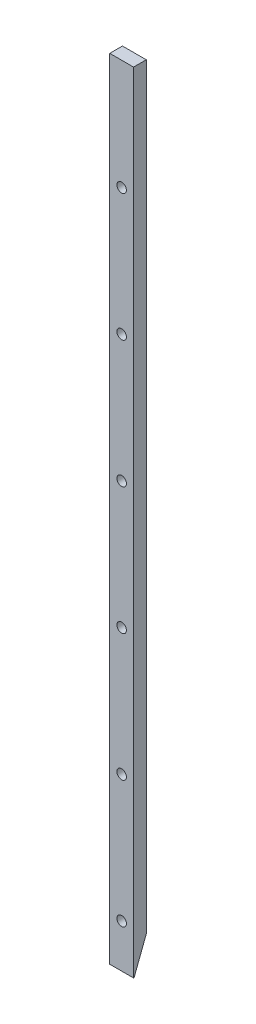
ISO-10303-21;
HEADER;
FILE_DESCRIPTION(('STEP AP214'),'2;1');
FILE_NAME('part.step','',(''),(''),'','','');
FILE_SCHEMA(('AUTOMOTIVE_DESIGN { 1 0 10303 214 1 1 1 1 }'));
ENDSEC;
DATA;
#1=APPLICATION_CONTEXT('core data for automotive mechanical design processes');
#2=APPLICATION_PROTOCOL_DEFINITION('international standard','automotive_design',2000,#1);
#3=PRODUCT_CONTEXT('',#1,'mechanical');
#4=PRODUCT('Part','Part','',(#3));
#5=PRODUCT_RELATED_PRODUCT_CATEGORY('part','',(#4));
#6=PRODUCT_DEFINITION_FORMATION('','',#4);
#7=PRODUCT_DEFINITION_CONTEXT('part definition',#1,'design');
#8=PRODUCT_DEFINITION('design','',#6,#7);
#9=PRODUCT_DEFINITION_SHAPE('','',#8);
#10=(LENGTH_UNIT() NAMED_UNIT(*) SI_UNIT(.MILLI.,.METRE.));
#11=(NAMED_UNIT(*) PLANE_ANGLE_UNIT() SI_UNIT($,.RADIAN.));
#12=(NAMED_UNIT(*) SI_UNIT($,.STERADIAN.) SOLID_ANGLE_UNIT());
#13=UNCERTAINTY_MEASURE_WITH_UNIT(LENGTH_MEASURE(1.E-05),#10,'distance_accuracy_value','');
#14=(GEOMETRIC_REPRESENTATION_CONTEXT(3) GLOBAL_UNCERTAINTY_ASSIGNED_CONTEXT((#13)) GLOBAL_UNIT_ASSIGNED_CONTEXT((#10,
#11,#12)) REPRESENTATION_CONTEXT('',''));
#15=CARTESIAN_POINT('',(0.,0.,0.));
#16=DIRECTION('',(0.,0.,1.));
#17=DIRECTION('',(1.,0.,0.));
#18=AXIS2_PLACEMENT_3D('',#15,#16,#17);
#19=CARTESIAN_POINT('',(0.,-221.04774439,-4.00000000000006));
#20=DIRECTION('',(0.,0.,1.));
#21=DIRECTION('',(1.,0.,0.));
#22=AXIS2_PLACEMENT_3D('',#19,#20,#21);
#23=CYLINDRICAL_SURFACE('',#22,3.);
#24=CARTESIAN_POINT('',(0.,-221.04774439,-1.00000000000017));
#25=DIRECTION('',(0.,0.,-1.));
#26=DIRECTION('',(-1.,0.,0.));
#27=AXIS2_PLACEMENT_3D('',#24,#25,#26);
#28=CIRCLE('',#27,3.);
#29=CARTESIAN_POINT('',(-3.00000000000003,-221.04774439,-1.00000000000017));
#30=VERTEX_POINT('',#29);
#31=EDGE_CURVE('E11',#30,#30,#28,.T.);
#32=ORIENTED_EDGE('',*,*,#31,.T.);
#33=EDGE_LOOP('',(#32));
#34=FACE_BOUND('',#33,.T.);
#35=CARTESIAN_POINT('',(0.,-221.04774439,3.99999999999995));
#36=DIRECTION('',(0.,0.,1.));
#37=DIRECTION('',(1.,0.,0.));
#38=AXIS2_PLACEMENT_3D('',#35,#36,#37);
#39=CIRCLE('',#38,3.);
#40=CARTESIAN_POINT('',(2.99999999999994,-221.04774439,3.99999999999995));
#41=VERTEX_POINT('',#40);
#42=EDGE_CURVE('E148',#41,#41,#39,.T.);
#43=ORIENTED_EDGE('',*,*,#42,.T.);
#44=EDGE_LOOP('',(#43));
#45=FACE_BOUND('',#44,.T.);
#46=ADVANCED_FACE('F42',(#34,#45),#23,.F.);
#47=CARTESIAN_POINT('',(0.,-141.04774439,-4.00000000000011));
#48=DIRECTION('',(0.,0.,1.));
#49=DIRECTION('',(1.,0.,0.));
#50=AXIS2_PLACEMENT_3D('',#47,#48,#49);
#51=CYLINDRICAL_SURFACE('',#50,3.);
#52=CARTESIAN_POINT('',(0.,-141.04774439,-1.00000000000011));
#53=DIRECTION('',(0.,0.,-1.));
#54=DIRECTION('',(-1.,0.,0.));
#55=AXIS2_PLACEMENT_3D('',#52,#53,#54);
#56=CIRCLE('',#55,3.);
#57=CARTESIAN_POINT('',(-3.00000000000003,-141.04774439,-1.00000000000011));
#58=VERTEX_POINT('',#57);
#59=EDGE_CURVE('E52',#58,#58,#56,.T.);
#60=ORIENTED_EDGE('',*,*,#59,.T.);
#61=EDGE_LOOP('',(#60));
#62=FACE_BOUND('',#61,.T.);
#63=CARTESIAN_POINT('',(-1.38777878078145E-13,-141.04774439,4.00000000000006));
#64=DIRECTION('',(0.,0.,1.));
#65=DIRECTION('',(1.,0.,0.));
#66=AXIS2_PLACEMENT_3D('',#63,#64,#65);
#67=CIRCLE('',#66,3.);
#68=CARTESIAN_POINT('',(2.99999999999986,-141.04774439,4.00000000000006));
#69=VERTEX_POINT('',#68);
#70=EDGE_CURVE('E144',#69,#69,#67,.T.);
#71=ORIENTED_EDGE('',*,*,#70,.T.);
#72=EDGE_LOOP('',(#71));
#73=FACE_BOUND('',#72,.T.);
#74=ADVANCED_FACE('F196',(#62,#73),#51,.F.);
#75=CARTESIAN_POINT('',(0.,-61.04774439,-4.00000000000011));
#76=DIRECTION('',(0.,0.,1.));
#77=DIRECTION('',(1.,0.,0.));
#78=AXIS2_PLACEMENT_3D('',#75,#76,#77);
#79=CYLINDRICAL_SURFACE('',#78,3.);
#80=CARTESIAN_POINT('',(-1.11022302462516E-13,-61.0477443899999,-1.00000000000017));
#81=DIRECTION('',(0.,0.,-1.));
#82=DIRECTION('',(-1.,0.,0.));
#83=AXIS2_PLACEMENT_3D('',#80,#81,#82);
#84=CIRCLE('',#83,3.);
#85=CARTESIAN_POINT('',(-3.00000000000011,-61.0477443899999,-1.00000000000017));
#86=VERTEX_POINT('',#85);
#87=EDGE_CURVE('E188',#86,#86,#84,.T.);
#88=ORIENTED_EDGE('',*,*,#87,.T.);
#89=EDGE_LOOP('',(#88));
#90=FACE_BOUND('',#89,.T.);
#91=CARTESIAN_POINT('',(-1.11022302462516E-13,-61.0477443899999,3.99999999999984));
#92=DIRECTION('',(0.,0.,1.));
#93=DIRECTION('',(1.,0.,0.));
#94=AXIS2_PLACEMENT_3D('',#91,#92,#93);
#95=CIRCLE('',#94,3.);
#96=CARTESIAN_POINT('',(2.99999999999989,-61.0477443899999,3.99999999999984));
#97=VERTEX_POINT('',#96);
#98=EDGE_CURVE('E140',#97,#97,#95,.T.);
#99=ORIENTED_EDGE('',*,*,#98,.T.);
#100=EDGE_LOOP('',(#99));
#101=FACE_BOUND('',#100,.T.);
#102=ADVANCED_FACE('F270',(#90,#101),#79,.F.);
#103=CARTESIAN_POINT('',(0.,18.9522556099998,-4.00000000000006));
#104=DIRECTION('',(0.,0.,1.));
#105=DIRECTION('',(1.,0.,0.));
#106=AXIS2_PLACEMENT_3D('',#103,#104,#105);
#107=CYLINDRICAL_SURFACE('',#106,3.);
#108=CARTESIAN_POINT('',(0.,18.9522556099999,-1.00000000000011));
#109=DIRECTION('',(0.,0.,-1.));
#110=DIRECTION('',(-1.,0.,0.));
#111=AXIS2_PLACEMENT_3D('',#108,#109,#110);
#112=CIRCLE('',#111,3.);
#113=CARTESIAN_POINT('',(-3.00000000000006,18.9522556099999,-1.00000000000011));
#114=VERTEX_POINT('',#113);
#115=EDGE_CURVE('E184',#114,#114,#112,.T.);
#116=ORIENTED_EDGE('',*,*,#115,.T.);
#117=EDGE_LOOP('',(#116));
#118=FACE_BOUND('',#117,.T.);
#119=CARTESIAN_POINT('',(0.,18.9522556099999,3.99999999999989));
#120=DIRECTION('',(0.,0.,1.));
#121=DIRECTION('',(1.,0.,0.));
#122=AXIS2_PLACEMENT_3D('',#119,#120,#121);
#123=CIRCLE('',#122,3.);
#124=CARTESIAN_POINT('',(2.99999999999997,18.9522556099999,3.99999999999989));
#125=VERTEX_POINT('',#124);
#126=EDGE_CURVE('E136',#125,#125,#123,.T.);
#127=ORIENTED_EDGE('',*,*,#126,.T.);
#128=EDGE_LOOP('',(#127));
#129=FACE_BOUND('',#128,.T.);
#130=ADVANCED_FACE('F316',(#118,#129),#107,.F.);
#131=CARTESIAN_POINT('',(7.49999999999998,-248.41,4.));
#132=DIRECTION('',(-1.,0.,0.));
#133=DIRECTION('',(0.,0.,1.));
#134=AXIS2_PLACEMENT_3D('',#131,#132,#133);
#135=PLANE('',#134);
#136=DIRECTION('',(0.,0.,-1.));
#137=VECTOR('',#136,1.);
#138=CARTESIAN_POINT('',(7.49999999999998,-248.41,4.));
#139=LINE('',#138,#137);
#140=CARTESIAN_POINT('',(7.49999999999998,-248.41,4.));
#141=VERTEX_POINT('',#140);
#142=CARTESIAN_POINT('',(7.50000000000001,-248.41,3.67728070070827));
#143=VERTEX_POINT('',#142);
#144=EDGE_CURVE('E227',#141,#143,#139,.T.);
#145=ORIENTED_EDGE('',*,*,#144,.T.);
#146=DIRECTION('',(0.,0.933580426497203,-0.358367949545297));
#147=VECTOR('',#146,1.);
#148=CARTESIAN_POINT('',(7.50000000000001,-248.41,3.67728070070827));
#149=LINE('',#148,#147);
#150=CARTESIAN_POINT('',(7.4999999999999,-228.41,-4.00000000000006));
#151=VERTEX_POINT('',#150);
#152=EDGE_CURVE('E67',#143,#151,#149,.T.);
#153=ORIENTED_EDGE('',*,*,#152,.T.);
#154=DIRECTION('',(0.,1.,0.));
#155=VECTOR('',#154,1.);
#156=CARTESIAN_POINT('',(7.49999999999995,-248.41,-4.00000000000011));
#157=LINE('',#156,#155);
#158=CARTESIAN_POINT('',(7.50000000000002,248.41,-4.00000000000011));
#159=VERTEX_POINT('',#158);
#160=EDGE_CURVE('E115',#151,#159,#157,.T.);
#161=ORIENTED_EDGE('',*,*,#160,.T.);
#162=DIRECTION('',(0.,0.,-1.));
#163=VECTOR('',#162,1.);
#164=CARTESIAN_POINT('',(7.49999999999997,248.41,4.));
#165=LINE('',#164,#163);
#166=CARTESIAN_POINT('',(7.49999999999997,248.41,4.));
#167=VERTEX_POINT('',#166);
#168=EDGE_CURVE('E96',#167,#159,#165,.T.);
#169=ORIENTED_EDGE('',*,*,#168,.F.);
#170=DIRECTION('',(0.,1.,0.));
#171=VECTOR('',#170,1.);
#172=CARTESIAN_POINT('',(7.49999999999998,-248.41,4.));
#173=LINE('',#172,#171);
#174=EDGE_CURVE('E103',#141,#167,#173,.T.);
#175=ORIENTED_EDGE('',*,*,#174,.F.);
#176=EDGE_LOOP('',(#145,#153,#161,#169,#175));
#177=FACE_BOUND('',#176,.T.);
#178=ADVANCED_FACE('F114',(#177),#135,.F.);
#179=CARTESIAN_POINT('',(-7.50000000000003,248.41,3.99999999999995));
#180=DIRECTION('',(0.,-1.,0.));
#181=DIRECTION('',(0.,0.,-1.));
#182=AXIS2_PLACEMENT_3D('',#179,#180,#181);
#183=PLANE('',#182);
#184=DIRECTION('',(-1.,0.,0.));
#185=VECTOR('',#184,1.);
#186=CARTESIAN_POINT('',(-7.50000000000003,248.41,-4.));
#187=LINE('',#186,#185);
#188=CARTESIAN_POINT('',(-7.50000000000003,248.41,-4.));
#189=VERTEX_POINT('',#188);
#190=EDGE_CURVE('E212',#159,#189,#187,.T.);
#191=ORIENTED_EDGE('',*,*,#190,.T.);
#192=DIRECTION('',(0.,0.,-1.));
#193=VECTOR('',#192,1.);
#194=CARTESIAN_POINT('',(-7.50000000000003,248.41,3.99999999999995));
#195=LINE('',#194,#193);
#196=CARTESIAN_POINT('',(-7.50000000000003,248.41,3.99999999999995));
#197=VERTEX_POINT('',#196);
#198=EDGE_CURVE('E98',#197,#189,#195,.T.);
#199=ORIENTED_EDGE('',*,*,#198,.F.);
#200=DIRECTION('',(-1.,0.,0.));
#201=VECTOR('',#200,1.);
#202=CARTESIAN_POINT('',(-7.50000000000003,248.41,3.99999999999995));
#203=LINE('',#202,#201);
#204=EDGE_CURVE('E92',#167,#197,#203,.T.);
#205=ORIENTED_EDGE('',*,*,#204,.F.);
#206=ORIENTED_EDGE('',*,*,#168,.T.);
#207=EDGE_LOOP('',(#191,#199,#205,#206));
#208=FACE_BOUND('',#207,.T.);
#209=ADVANCED_FACE('F94',(#208),#183,.F.);
#210=CARTESIAN_POINT('',(-7.50000000000015,-248.41,3.99999999999989));
#211=DIRECTION('',(1.,0.,0.));
#212=DIRECTION('',(0.,0.,-1.));
#213=AXIS2_PLACEMENT_3D('',#210,#211,#212);
#214=PLANE('',#213);
#215=DIRECTION('',(0.,-1.,0.));
#216=VECTOR('',#215,1.);
#217=CARTESIAN_POINT('',(-7.50000000000009,-248.41,-3.99999999999995));
#218=LINE('',#217,#216);
#219=CARTESIAN_POINT('',(-7.50000000000012,-228.41,-4.00000000000011));
#220=VERTEX_POINT('',#219);
#221=EDGE_CURVE('E112',#189,#220,#218,.T.);
#222=ORIENTED_EDGE('',*,*,#221,.T.);
#223=DIRECTION('',(0.,-0.933580426497203,0.358367949545297));
#224=VECTOR('',#223,1.);
#225=CARTESIAN_POINT('',(-7.50000000000003,-248.41,3.67728070070833));
#226=LINE('',#225,#224);
#227=CARTESIAN_POINT('',(-7.50000000000003,-248.41,3.67728070070833));
#228=VERTEX_POINT('',#227);
#229=EDGE_CURVE('E133',#220,#228,#226,.T.);
#230=ORIENTED_EDGE('',*,*,#229,.T.);
#231=DIRECTION('',(0.,0.,-1.));
#232=VECTOR('',#231,1.);
#233=CARTESIAN_POINT('',(-7.50000000000015,-248.41,3.99999999999989));
#234=LINE('',#233,#232);
#235=CARTESIAN_POINT('',(-7.50000000000015,-248.41,3.99999999999989));
#236=VERTEX_POINT('',#235);
#237=EDGE_CURVE('E125',#236,#228,#234,.T.);
#238=ORIENTED_EDGE('',*,*,#237,.F.);
#239=DIRECTION('',(0.,-1.,0.));
#240=VECTOR('',#239,1.);
#241=CARTESIAN_POINT('',(-7.50000000000015,-248.41,3.99999999999989));
#242=LINE('',#241,#240);
#243=EDGE_CURVE('E102',#197,#236,#242,.T.);
#244=ORIENTED_EDGE('',*,*,#243,.F.);
#245=ORIENTED_EDGE('',*,*,#198,.T.);
#246=EDGE_LOOP('',(#222,#230,#238,#244,#245));
#247=FACE_BOUND('',#246,.T.);
#248=ADVANCED_FACE('F223',(#247),#214,.F.);
#249=CARTESIAN_POINT('',(-7.50000000000015,-248.41,3.99999999999989));
#250=DIRECTION('',(0.,1.,0.));
#251=DIRECTION('',(0.,0.,1.));
#252=AXIS2_PLACEMENT_3D('',#249,#250,#251);
#253=PLANE('',#252);
#254=ORIENTED_EDGE('',*,*,#237,.T.);
#255=DIRECTION('',(1.,0.,0.));
#256=VECTOR('',#255,1.);
#257=CARTESIAN_POINT('',(7.50000000000001,-248.41,3.67728070070827));
#258=LINE('',#257,#256);
#259=EDGE_CURVE('E118',#228,#143,#258,.T.);
#260=ORIENTED_EDGE('',*,*,#259,.T.);
#261=ORIENTED_EDGE('',*,*,#144,.F.);
#262=DIRECTION('',(1.,0.,0.));
#263=VECTOR('',#262,1.);
#264=CARTESIAN_POINT('',(-7.50000000000015,-248.41,3.99999999999989));
#265=LINE('',#264,#263);
#266=EDGE_CURVE('E109',#236,#141,#265,.T.);
#267=ORIENTED_EDGE('',*,*,#266,.F.);
#268=EDGE_LOOP('',(#254,#260,#261,#267));
#269=FACE_BOUND('',#268,.T.);
#270=ADVANCED_FACE('F225',(#269),#253,.F.);
#271=CARTESIAN_POINT('',(0.,2.22044604925031E-13,3.99999999999995));
#272=DIRECTION('',(0.,0.,-1.));
#273=DIRECTION('',(-1.,0.,0.));
#274=AXIS2_PLACEMENT_3D('',#271,#272,#273);
#275=PLANE('',#274);
#276=CARTESIAN_POINT('',(0.,98.95225561,3.99999999999989));
#277=DIRECTION('',(0.,0.,1.));
#278=DIRECTION('',(1.,0.,0.));
#279=AXIS2_PLACEMENT_3D('',#276,#277,#278);
#280=CIRCLE('',#279,3.);
#281=CARTESIAN_POINT('',(2.99999999999993,98.95225561,3.99999999999989));
#282=VERTEX_POINT('',#281);
#283=EDGE_CURVE('E243',#282,#282,#280,.T.);
#284=ORIENTED_EDGE('',*,*,#283,.F.);
#285=EDGE_LOOP('',(#284));
#286=FACE_BOUND('',#285,.T.);
#287=CARTESIAN_POINT('',(0.,178.95225561,4.));
#288=DIRECTION('',(0.,0.,1.));
#289=DIRECTION('',(1.,0.,0.));
#290=AXIS2_PLACEMENT_3D('',#287,#288,#289);
#291=CIRCLE('',#290,3.);
#292=CARTESIAN_POINT('',(2.99999999999994,178.95225561,4.));
#293=VERTEX_POINT('',#292);
#294=EDGE_CURVE('E214',#293,#293,#291,.T.);
#295=ORIENTED_EDGE('',*,*,#294,.F.);
#296=EDGE_LOOP('',(#295));
#297=FACE_BOUND('',#296,.T.);
#298=ORIENTED_EDGE('',*,*,#174,.T.);
#299=ORIENTED_EDGE('',*,*,#204,.T.);
#300=ORIENTED_EDGE('',*,*,#243,.T.);
#301=ORIENTED_EDGE('',*,*,#266,.T.);
#302=EDGE_LOOP('',(#298,#299,#300,#301));
#303=FACE_BOUND('',#302,.T.);
#304=ORIENTED_EDGE('',*,*,#126,.F.);
#305=EDGE_LOOP('',(#304));
#306=FACE_BOUND('',#305,.T.);
#307=ORIENTED_EDGE('',*,*,#98,.F.);
#308=EDGE_LOOP('',(#307));
#309=FACE_BOUND('',#308,.T.);
#310=ORIENTED_EDGE('',*,*,#70,.F.);
#311=EDGE_LOOP('',(#310));
#312=FACE_BOUND('',#311,.T.);
#313=ORIENTED_EDGE('',*,*,#42,.F.);
#314=EDGE_LOOP('',(#313));
#315=FACE_BOUND('',#314,.T.);
#316=ADVANCED_FACE('F106',(#286,#297,#303,#306,#309,#312,#315),#275,.F.);
#317=CARTESIAN_POINT('',(0.,1.11022302462516E-13,-4.00000000000011));
#318=DIRECTION('',(0.,0.,-1.));
#319=DIRECTION('',(-1.,0.,0.));
#320=AXIS2_PLACEMENT_3D('',#317,#318,#319);
#321=PLANE('',#320);
#322=CARTESIAN_POINT('',(0.,178.95225561,-4.00000000000006));
#323=DIRECTION('',(0.,0.,-1.));
#324=DIRECTION('',(-1.,0.,0.));
#325=AXIS2_PLACEMENT_3D('',#322,#323,#324);
#326=CIRCLE('',#325,6.00000000000001);
#327=CARTESIAN_POINT('',(-6.00000000000003,178.95225561,-4.00000000000006));
#328=VERTEX_POINT('',#327);
#329=EDGE_CURVE('E172',#328,#328,#326,.F.);
#330=ORIENTED_EDGE('',*,*,#329,.T.);
#331=EDGE_LOOP('',(#330));
#332=FACE_BOUND('',#331,.T.);
#333=CARTESIAN_POINT('',(0.,98.9522556100002,-4.00000000000006));
#334=DIRECTION('',(0.,0.,-1.));
#335=DIRECTION('',(-1.,0.,0.));
#336=AXIS2_PLACEMENT_3D('',#333,#334,#335);
#337=CIRCLE('',#336,6.00000000000001);
#338=CARTESIAN_POINT('',(-6.00000000000003,98.9522556100002,-4.00000000000006));
#339=VERTEX_POINT('',#338);
#340=EDGE_CURVE('E168',#339,#339,#337,.F.);
#341=ORIENTED_EDGE('',*,*,#340,.T.);
#342=EDGE_LOOP('',(#341));
#343=FACE_BOUND('',#342,.T.);
#344=CARTESIAN_POINT('',(0.,18.9522556099998,-4.00000000000006));
#345=DIRECTION('',(0.,0.,-1.));
#346=DIRECTION('',(-1.,0.,0.));
#347=AXIS2_PLACEMENT_3D('',#344,#345,#346);
#348=CIRCLE('',#347,6.00000000000001);
#349=CARTESIAN_POINT('',(-6.00000000000003,18.9522556099998,-4.00000000000006));
#350=VERTEX_POINT('',#349);
#351=EDGE_CURVE('E164',#350,#350,#348,.F.);
#352=ORIENTED_EDGE('',*,*,#351,.T.);
#353=EDGE_LOOP('',(#352));
#354=FACE_BOUND('',#353,.T.);
#355=CARTESIAN_POINT('',(0.,-61.04774439,-4.00000000000011));
#356=DIRECTION('',(0.,0.,-1.));
#357=DIRECTION('',(-1.,0.,0.));
#358=AXIS2_PLACEMENT_3D('',#355,#356,#357);
#359=CIRCLE('',#358,6.00000000000001);
#360=CARTESIAN_POINT('',(-6.00000000000006,-61.04774439,-4.00000000000012));
#361=VERTEX_POINT('',#360);
#362=EDGE_CURVE('E160',#361,#361,#359,.F.);
#363=ORIENTED_EDGE('',*,*,#362,.T.);
#364=EDGE_LOOP('',(#363));
#365=FACE_BOUND('',#364,.T.);
#366=CARTESIAN_POINT('',(0.,-141.04774439,-4.00000000000011));
#367=DIRECTION('',(0.,0.,-1.));
#368=DIRECTION('',(-1.,0.,0.));
#369=AXIS2_PLACEMENT_3D('',#366,#367,#368);
#370=CIRCLE('',#369,6.00000000000001);
#371=CARTESIAN_POINT('',(-6.00000000000009,-141.04774439,-4.00000000000012));
#372=VERTEX_POINT('',#371);
#373=EDGE_CURVE('E156',#372,#372,#370,.F.);
#374=ORIENTED_EDGE('',*,*,#373,.T.);
#375=EDGE_LOOP('',(#374));
#376=FACE_BOUND('',#375,.T.);
#377=CARTESIAN_POINT('',(0.,-221.04774439,-4.00000000000006));
#378=DIRECTION('',(0.,0.,-1.));
#379=DIRECTION('',(-1.,0.,0.));
#380=AXIS2_PLACEMENT_3D('',#377,#378,#379);
#381=CIRCLE('',#380,6.00000000000001);
#382=CARTESIAN_POINT('',(-6.00000000000003,-221.04774439,-4.00000000000006));
#383=VERTEX_POINT('',#382);
#384=EDGE_CURVE('E152',#383,#383,#381,.F.);
#385=ORIENTED_EDGE('',*,*,#384,.T.);
#386=EDGE_LOOP('',(#385));
#387=FACE_BOUND('',#386,.T.);
#388=ORIENTED_EDGE('',*,*,#160,.F.);
#389=DIRECTION('',(-1.,0.,0.));
#390=VECTOR('',#389,1.);
#391=CARTESIAN_POINT('',(-7.50000000000012,-228.41,-4.00000000000011));
#392=LINE('',#391,#390);
#393=EDGE_CURVE('E59',#151,#220,#392,.T.);
#394=ORIENTED_EDGE('',*,*,#393,.T.);
#395=ORIENTED_EDGE('',*,*,#221,.F.);
#396=ORIENTED_EDGE('',*,*,#190,.F.);
#397=EDGE_LOOP('',(#388,#394,#395,#396));
#398=FACE_BOUND('',#397,.T.);
#399=ADVANCED_FACE('F205',(#332,#343,#354,#365,#376,#387,#398),#321,.T.);
#400=CARTESIAN_POINT('',(0.,178.95225561,-4.00000000000006));
#401=DIRECTION('',(0.,0.,1.));
#402=DIRECTION('',(1.,0.,0.));
#403=AXIS2_PLACEMENT_3D('',#400,#401,#402);
#404=CYLINDRICAL_SURFACE('',#403,3.);
#405=CARTESIAN_POINT('',(0.,178.95225561,-1.00000000000017));
#406=DIRECTION('',(0.,0.,-1.));
#407=DIRECTION('',(-1.,0.,0.));
#408=AXIS2_PLACEMENT_3D('',#405,#406,#407);
#409=CIRCLE('',#408,3.);
#410=CARTESIAN_POINT('',(-3.00000000000004,178.95225561,-1.00000000000017));
#411=VERTEX_POINT('',#410);
#412=EDGE_CURVE('E176',#411,#411,#409,.T.);
#413=ORIENTED_EDGE('',*,*,#412,.T.);
#414=EDGE_LOOP('',(#413));
#415=FACE_BOUND('',#414,.T.);
#416=ORIENTED_EDGE('',*,*,#294,.T.);
#417=EDGE_LOOP('',(#416));
#418=FACE_BOUND('',#417,.T.);
#419=ADVANCED_FACE('F208',(#415,#418),#404,.F.);
#420=CARTESIAN_POINT('',(-7.50000000000003,-248.41,3.67728070070833));
#421=DIRECTION('',(0.,-0.358367949545297,-0.933580426497203));
#422=DIRECTION('',(-1.,0.,0.));
#423=AXIS2_PLACEMENT_3D('',#420,#421,#422);
#424=PLANE('',#423);
#425=ORIENTED_EDGE('',*,*,#229,.F.);
#426=ORIENTED_EDGE('',*,*,#393,.F.);
#427=ORIENTED_EDGE('',*,*,#152,.F.);
#428=ORIENTED_EDGE('',*,*,#259,.F.);
#429=EDGE_LOOP('',(#425,#426,#427,#428));
#430=FACE_BOUND('',#429,.T.);
#431=ADVANCED_FACE('F218',(#430),#424,.T.);
#432=CARTESIAN_POINT('',(0.,98.9522556100002,-4.00000000000006));
#433=DIRECTION('',(0.,0.,1.));
#434=DIRECTION('',(1.,0.,0.));
#435=AXIS2_PLACEMENT_3D('',#432,#433,#434);
#436=CYLINDRICAL_SURFACE('',#435,3.);
#437=CARTESIAN_POINT('',(0.,98.9522556100001,-1.00000000000006));
#438=DIRECTION('',(0.,0.,-1.));
#439=DIRECTION('',(-1.,0.,0.));
#440=AXIS2_PLACEMENT_3D('',#437,#438,#439);
#441=CIRCLE('',#440,3.);
#442=CARTESIAN_POINT('',(-3.00000000000006,98.9522556100001,-1.00000000000006));
#443=VERTEX_POINT('',#442);
#444=EDGE_CURVE('E180',#443,#443,#441,.T.);
#445=ORIENTED_EDGE('',*,*,#444,.T.);
#446=EDGE_LOOP('',(#445));
#447=FACE_BOUND('',#446,.T.);
#448=ORIENTED_EDGE('',*,*,#283,.T.);
#449=EDGE_LOOP('',(#448));
#450=FACE_BOUND('',#449,.T.);
#451=ADVANCED_FACE('F249',(#447,#450),#436,.F.);
#452=CARTESIAN_POINT('',(0.,178.95225561,-4.00000000000006));
#453=DIRECTION('',(0.,0.,-1.));
#454=DIRECTION('',(-1.,0.,0.));
#455=AXIS2_PLACEMENT_3D('',#452,#453,#454);
#456=CONICAL_SURFACE('',#455,6.00000000000001,0.78539816339745);
#457=ORIENTED_EDGE('',*,*,#412,.F.);
#458=EDGE_LOOP('',(#457));
#459=FACE_BOUND('',#458,.T.);
#460=ORIENTED_EDGE('',*,*,#329,.F.);
#461=EDGE_LOOP('',(#460));
#462=FACE_BOUND('',#461,.T.);
#463=ADVANCED_FACE('F276',(#459,#462),#456,.F.);
#464=CARTESIAN_POINT('',(0.,98.9522556100002,-4.00000000000006));
#465=DIRECTION('',(0.,0.,-1.));
#466=DIRECTION('',(-1.,0.,0.));
#467=AXIS2_PLACEMENT_3D('',#464,#465,#466);
#468=CONICAL_SURFACE('',#467,6.00000000000001,0.78539816339745);
#469=ORIENTED_EDGE('',*,*,#444,.F.);
#470=EDGE_LOOP('',(#469));
#471=FACE_BOUND('',#470,.T.);
#472=ORIENTED_EDGE('',*,*,#340,.F.);
#473=EDGE_LOOP('',(#472));
#474=FACE_BOUND('',#473,.T.);
#475=ADVANCED_FACE('F283',(#471,#474),#468,.F.);
#476=CARTESIAN_POINT('',(0.,18.9522556099998,-4.00000000000006));
#477=DIRECTION('',(0.,0.,-1.));
#478=DIRECTION('',(-1.,0.,0.));
#479=AXIS2_PLACEMENT_3D('',#476,#477,#478);
#480=CONICAL_SURFACE('',#479,6.00000000000001,0.78539816339745);
#481=ORIENTED_EDGE('',*,*,#115,.F.);
#482=EDGE_LOOP('',(#481));
#483=FACE_BOUND('',#482,.T.);
#484=ORIENTED_EDGE('',*,*,#351,.F.);
#485=EDGE_LOOP('',(#484));
#486=FACE_BOUND('',#485,.T.);
#487=ADVANCED_FACE('F290',(#483,#486),#480,.F.);
#488=CARTESIAN_POINT('',(0.,-61.04774439,-4.00000000000011));
#489=DIRECTION('',(0.,0.,-1.));
#490=DIRECTION('',(-1.,0.,0.));
#491=AXIS2_PLACEMENT_3D('',#488,#489,#490);
#492=CONICAL_SURFACE('',#491,6.00000000000001,0.78539816339745);
#493=ORIENTED_EDGE('',*,*,#87,.F.);
#494=EDGE_LOOP('',(#493));
#495=FACE_BOUND('',#494,.T.);
#496=ORIENTED_EDGE('',*,*,#362,.F.);
#497=EDGE_LOOP('',(#496));
#498=FACE_BOUND('',#497,.T.);
#499=ADVANCED_FACE('F202',(#495,#498),#492,.F.);
#500=CARTESIAN_POINT('',(0.,-141.04774439,-4.00000000000011));
#501=DIRECTION('',(0.,0.,-1.));
#502=DIRECTION('',(-1.,0.,0.));
#503=AXIS2_PLACEMENT_3D('',#500,#501,#502);
#504=CONICAL_SURFACE('',#503,6.00000000000001,0.78539816339745);
#505=ORIENTED_EDGE('',*,*,#59,.F.);
#506=EDGE_LOOP('',(#505));
#507=FACE_BOUND('',#506,.T.);
#508=ORIENTED_EDGE('',*,*,#373,.F.);
#509=EDGE_LOOP('',(#508));
#510=FACE_BOUND('',#509,.T.);
#511=ADVANCED_FACE('F199',(#507,#510),#504,.F.);
#512=CARTESIAN_POINT('',(0.,-221.04774439,-4.00000000000006));
#513=DIRECTION('',(0.,0.,-1.));
#514=DIRECTION('',(-1.,0.,0.));
#515=AXIS2_PLACEMENT_3D('',#512,#513,#514);
#516=CONICAL_SURFACE('',#515,6.00000000000001,0.78539816339745);
#517=ORIENTED_EDGE('',*,*,#31,.F.);
#518=EDGE_LOOP('',(#517));
#519=FACE_BOUND('',#518,.T.);
#520=ORIENTED_EDGE('',*,*,#384,.F.);
#521=EDGE_LOOP('',(#520));
#522=FACE_BOUND('',#521,.T.);
#523=ADVANCED_FACE('F45',(#519,#522),#516,.F.);
#524=CLOSED_SHELL('',(#46,#74,#102,#130,#178,#209,#248,#270,#316,#399,#419,#431,#451,#463,#475,
#487,#499,#511,#523));
#525=MANIFOLD_SOLID_BREP('B2',#524);
#526=ADVANCED_BREP_SHAPE_REPRESENTATION('',(#18,#525),#14);
#527=SHAPE_DEFINITION_REPRESENTATION(#9,#526);
ENDSEC;
END-ISO-10303-21;
